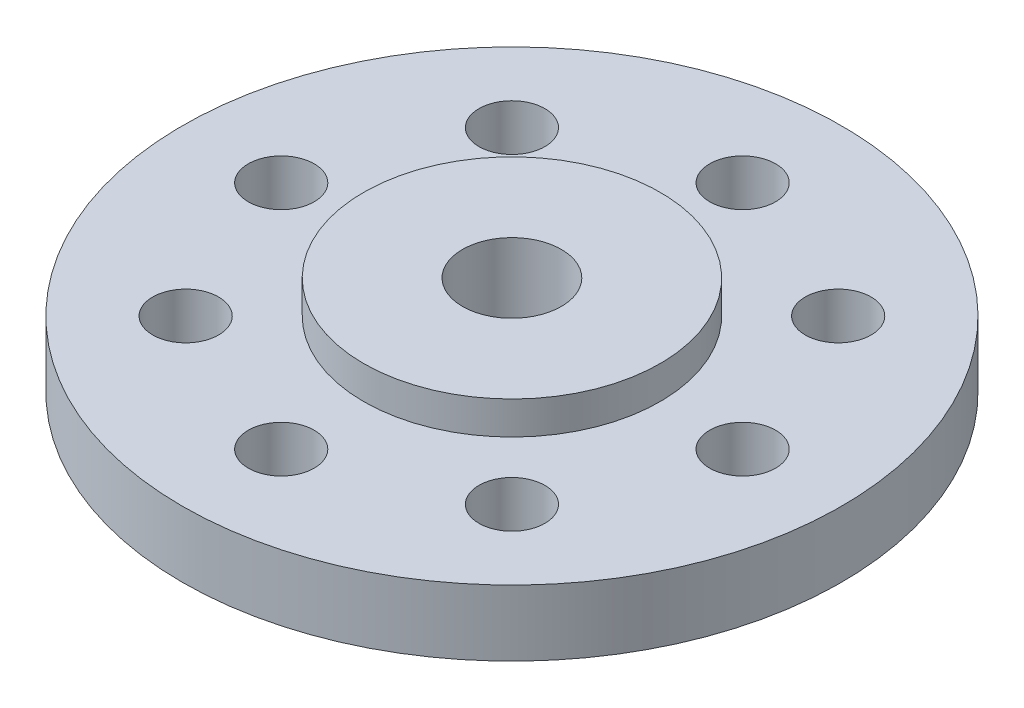
ISO-10303-21;
HEADER;
FILE_DESCRIPTION(('STEP AP214'),'2;1');
FILE_NAME('part.step','',(''),(''),'','','');
FILE_SCHEMA(('AUTOMOTIVE_DESIGN { 1 0 10303 214 1 1 1 1 }'));
ENDSEC;
DATA;
#1=APPLICATION_CONTEXT('core data for automotive mechanical design processes');
#2=APPLICATION_PROTOCOL_DEFINITION('international standard','automotive_design',2000,#1);
#3=PRODUCT_CONTEXT('',#1,'mechanical');
#4=PRODUCT('Part','Part','',(#3));
#5=PRODUCT_RELATED_PRODUCT_CATEGORY('part','',(#4));
#6=PRODUCT_DEFINITION_FORMATION('','',#4);
#7=PRODUCT_DEFINITION_CONTEXT('part definition',#1,'design');
#8=PRODUCT_DEFINITION('design','',#6,#7);
#9=PRODUCT_DEFINITION_SHAPE('','',#8);
#10=(LENGTH_UNIT() NAMED_UNIT(*) SI_UNIT(.MILLI.,.METRE.));
#11=(NAMED_UNIT(*) PLANE_ANGLE_UNIT() SI_UNIT($,.RADIAN.));
#12=(NAMED_UNIT(*) SI_UNIT($,.STERADIAN.) SOLID_ANGLE_UNIT());
#13=UNCERTAINTY_MEASURE_WITH_UNIT(LENGTH_MEASURE(1.E-05),#10,'distance_accuracy_value','');
#14=(GEOMETRIC_REPRESENTATION_CONTEXT(3) GLOBAL_UNCERTAINTY_ASSIGNED_CONTEXT((#13)) GLOBAL_UNIT_ASSIGNED_CONTEXT((#10,
#11,#12)) REPRESENTATION_CONTEXT('',''));
#15=CARTESIAN_POINT('',(0.,0.,0.));
#16=DIRECTION('',(0.,0.,1.));
#17=DIRECTION('',(1.,0.,0.));
#18=AXIS2_PLACEMENT_3D('',#15,#16,#17);
#19=CARTESIAN_POINT('',(0.,3.,0.));
#20=DIRECTION('',(0.,-1.,0.));
#21=DIRECTION('',(0.,0.,-1.));
#22=AXIS2_PLACEMENT_3D('',#19,#20,#21);
#23=CYLINDRICAL_SURFACE('',#22,10.);
#24=CARTESIAN_POINT('',(0.,3.,0.));
#25=DIRECTION('',(0.,1.,0.));
#26=DIRECTION('',(0.,0.,1.));
#27=AXIS2_PLACEMENT_3D('',#24,#25,#26);
#28=CIRCLE('',#27,10.);
#29=CARTESIAN_POINT('',(0.,3.,10.));
#30=VERTEX_POINT('',#29);
#31=EDGE_CURVE('E46',#30,#30,#28,.T.);
#32=ORIENTED_EDGE('',*,*,#31,.F.);
#33=EDGE_LOOP('',(#32));
#34=FACE_BOUND('',#33,.T.);
#35=CARTESIAN_POINT('',(0.,1.,0.));
#36=DIRECTION('',(0.,1.,0.));
#37=DIRECTION('',(0.,0.,1.));
#38=AXIS2_PLACEMENT_3D('',#35,#36,#37);
#39=CIRCLE('',#38,10.);
#40=CARTESIAN_POINT('',(0.,1.,10.));
#41=VERTEX_POINT('',#40);
#42=EDGE_CURVE('E51',#41,#41,#39,.T.);
#43=ORIENTED_EDGE('',*,*,#42,.T.);
#44=EDGE_LOOP('',(#43));
#45=FACE_BOUND('',#44,.T.);
#46=ADVANCED_FACE('F39',(#34,#45),#23,.T.);
#47=CARTESIAN_POINT('',(0.,3.,0.));
#48=DIRECTION('',(0.,1.,0.));
#49=DIRECTION('',(0.,0.,1.));
#50=AXIS2_PLACEMENT_3D('',#47,#48,#49);
#51=PLANE('',#50);
#52=CARTESIAN_POINT('',(-7.,3.,0.));
#53=DIRECTION('',(0.,1.,0.));
#54=DIRECTION('',(0.,0.,1.));
#55=AXIS2_PLACEMENT_3D('',#52,#53,#54);
#56=CIRCLE('',#55,1.);
#57=CARTESIAN_POINT('',(-7.,3.,1.));
#58=VERTEX_POINT('',#57);
#59=EDGE_CURVE('E96',#58,#58,#56,.F.);
#60=ORIENTED_EDGE('',*,*,#59,.T.);
#61=EDGE_LOOP('',(#60));
#62=FACE_BOUND('',#61,.T.);
#63=CARTESIAN_POINT('',(-4.94974746830583,3.,-4.94974746830584));
#64=DIRECTION('',(0.,1.,0.));
#65=DIRECTION('',(0.,0.,1.));
#66=AXIS2_PLACEMENT_3D('',#63,#64,#65);
#67=CIRCLE('',#66,1.);
#68=CARTESIAN_POINT('',(-4.94974746830583,3.,-3.94974746830584));
#69=VERTEX_POINT('',#68);
#70=EDGE_CURVE('E85',#69,#69,#67,.F.);
#71=ORIENTED_EDGE('',*,*,#70,.T.);
#72=EDGE_LOOP('',(#71));
#73=FACE_BOUND('',#72,.T.);
#74=CARTESIAN_POINT('',(0.,3.,-7.));
#75=DIRECTION('',(0.,1.,0.));
#76=DIRECTION('',(0.,0.,1.));
#77=AXIS2_PLACEMENT_3D('',#74,#75,#76);
#78=CIRCLE('',#77,1.);
#79=CARTESIAN_POINT('',(0.,3.,-6.));
#80=VERTEX_POINT('',#79);
#81=EDGE_CURVE('E82',#80,#80,#78,.F.);
#82=ORIENTED_EDGE('',*,*,#81,.T.);
#83=EDGE_LOOP('',(#82));
#84=FACE_BOUND('',#83,.T.);
#85=CARTESIAN_POINT('',(4.94974746830586,3.,-4.94974746830581));
#86=DIRECTION('',(0.,1.,0.));
#87=DIRECTION('',(0.,0.,1.));
#88=AXIS2_PLACEMENT_3D('',#85,#86,#87);
#89=CIRCLE('',#88,0.999999999999999);
#90=CARTESIAN_POINT('',(4.94974746830586,3.,-3.94974746830581));
#91=VERTEX_POINT('',#90);
#92=EDGE_CURVE('E79',#91,#91,#89,.F.);
#93=ORIENTED_EDGE('',*,*,#92,.T.);
#94=EDGE_LOOP('',(#93));
#95=FACE_BOUND('',#94,.T.);
#96=CARTESIAN_POINT('',(7.,3.,0.));
#97=DIRECTION('',(0.,1.,0.));
#98=DIRECTION('',(0.,0.,1.));
#99=AXIS2_PLACEMENT_3D('',#96,#97,#98);
#100=CIRCLE('',#99,0.999999999999999);
#101=CARTESIAN_POINT('',(7.,3.,1.00000000000005));
#102=VERTEX_POINT('',#101);
#103=EDGE_CURVE('E75',#102,#102,#100,.F.);
#104=ORIENTED_EDGE('',*,*,#103,.T.);
#105=EDGE_LOOP('',(#104));
#106=FACE_BOUND('',#105,.T.);
#107=CARTESIAN_POINT('',(4.94974746830579,3.,4.94974746830588));
#108=DIRECTION('',(0.,1.,0.));
#109=DIRECTION('',(0.,0.,1.));
#110=AXIS2_PLACEMENT_3D('',#107,#108,#109);
#111=CIRCLE('',#110,1.);
#112=CARTESIAN_POINT('',(4.94974746830579,3.,5.94974746830588));
#113=VERTEX_POINT('',#112);
#114=EDGE_CURVE('E71',#113,#113,#111,.F.);
#115=ORIENTED_EDGE('',*,*,#114,.T.);
#116=EDGE_LOOP('',(#115));
#117=FACE_BOUND('',#116,.T.);
#118=CARTESIAN_POINT('',(0.,3.,7.));
#119=DIRECTION('',(0.,1.,0.));
#120=DIRECTION('',(0.,0.,1.));
#121=AXIS2_PLACEMENT_3D('',#118,#119,#120);
#122=CIRCLE('',#121,1.);
#123=CARTESIAN_POINT('',(0.,3.,8.));
#124=VERTEX_POINT('',#123);
#125=EDGE_CURVE('E67',#124,#124,#122,.F.);
#126=ORIENTED_EDGE('',*,*,#125,.T.);
#127=EDGE_LOOP('',(#126));
#128=FACE_BOUND('',#127,.T.);
#129=CARTESIAN_POINT('',(-4.94974746830589,3.,4.94974746830577));
#130=DIRECTION('',(0.,1.,0.));
#131=DIRECTION('',(0.,0.,1.));
#132=AXIS2_PLACEMENT_3D('',#129,#130,#131);
#133=CIRCLE('',#132,1.);
#134=CARTESIAN_POINT('',(-4.94974746830589,3.,5.94974746830577));
#135=VERTEX_POINT('',#134);
#136=EDGE_CURVE('E62',#135,#135,#133,.F.);
#137=ORIENTED_EDGE('',*,*,#136,.T.);
#138=EDGE_LOOP('',(#137));
#139=FACE_BOUND('',#138,.T.);
#140=CARTESIAN_POINT('',(0.,3.,0.));
#141=DIRECTION('',(0.,1.,0.));
#142=DIRECTION('',(0.,0.,1.));
#143=AXIS2_PLACEMENT_3D('',#140,#141,#142);
#144=CIRCLE('',#143,4.5);
#145=CARTESIAN_POINT('',(0.,3.,4.5));
#146=VERTEX_POINT('',#145);
#147=EDGE_CURVE('E11',#146,#146,#144,.T.);
#148=ORIENTED_EDGE('',*,*,#147,.F.);
#149=EDGE_LOOP('',(#148));
#150=FACE_BOUND('',#149,.T.);
#151=ORIENTED_EDGE('',*,*,#31,.T.);
#152=EDGE_LOOP('',(#151));
#153=FACE_BOUND('',#152,.T.);
#154=ADVANCED_FACE('F110',(#62,#73,#84,#95,#106,#117,#128,#139,#150,#153),#51,.T.);
#155=CARTESIAN_POINT('',(0.,1.,0.));
#156=DIRECTION('',(0.,1.,0.));
#157=DIRECTION('',(0.,0.,1.));
#158=AXIS2_PLACEMENT_3D('',#155,#156,#157);
#159=PLANE('',#158);
#160=CARTESIAN_POINT('',(0.,1.,0.));
#161=DIRECTION('',(0.,1.,0.));
#162=DIRECTION('',(0.,0.,1.));
#163=AXIS2_PLACEMENT_3D('',#160,#161,#162);
#164=CIRCLE('',#163,1.5);
#165=CARTESIAN_POINT('',(0.,1.,1.5));
#166=VERTEX_POINT('',#165);
#167=EDGE_CURVE('E63',#166,#166,#164,.F.);
#168=ORIENTED_EDGE('',*,*,#167,.F.);
#169=EDGE_LOOP('',(#168));
#170=FACE_BOUND('',#169,.T.);
#171=CARTESIAN_POINT('',(-7.,1.,0.));
#172=DIRECTION('',(0.,1.,0.));
#173=DIRECTION('',(0.,0.,1.));
#174=AXIS2_PLACEMENT_3D('',#171,#172,#173);
#175=CIRCLE('',#174,1.);
#176=CARTESIAN_POINT('',(-7.,1.,1.));
#177=VERTEX_POINT('',#176);
#178=EDGE_CURVE('E42',#177,#177,#175,.F.);
#179=ORIENTED_EDGE('',*,*,#178,.F.);
#180=EDGE_LOOP('',(#179));
#181=FACE_BOUND('',#180,.T.);
#182=CARTESIAN_POINT('',(-4.94974746830583,1.,-4.94974746830584));
#183=DIRECTION('',(0.,1.,0.));
#184=DIRECTION('',(0.,0.,1.));
#185=AXIS2_PLACEMENT_3D('',#182,#183,#184);
#186=CIRCLE('',#185,1.);
#187=CARTESIAN_POINT('',(-4.94974746830583,1.,-3.94974746830584));
#188=VERTEX_POINT('',#187);
#189=EDGE_CURVE('E83',#188,#188,#186,.F.);
#190=ORIENTED_EDGE('',*,*,#189,.F.);
#191=EDGE_LOOP('',(#190));
#192=FACE_BOUND('',#191,.T.);
#193=CARTESIAN_POINT('',(0.,1.,-7.));
#194=DIRECTION('',(0.,1.,0.));
#195=DIRECTION('',(0.,0.,1.));
#196=AXIS2_PLACEMENT_3D('',#193,#194,#195);
#197=CIRCLE('',#196,1.);
#198=CARTESIAN_POINT('',(0.,1.,-6.));
#199=VERTEX_POINT('',#198);
#200=EDGE_CURVE('E80',#199,#199,#197,.F.);
#201=ORIENTED_EDGE('',*,*,#200,.F.);
#202=EDGE_LOOP('',(#201));
#203=FACE_BOUND('',#202,.T.);
#204=CARTESIAN_POINT('',(4.94974746830586,1.,-4.94974746830581));
#205=DIRECTION('',(0.,1.,0.));
#206=DIRECTION('',(0.,0.,1.));
#207=AXIS2_PLACEMENT_3D('',#204,#205,#206);
#208=CIRCLE('',#207,0.999999999999999);
#209=CARTESIAN_POINT('',(4.94974746830586,1.,-3.94974746830581));
#210=VERTEX_POINT('',#209);
#211=EDGE_CURVE('E76',#210,#210,#208,.F.);
#212=ORIENTED_EDGE('',*,*,#211,.F.);
#213=EDGE_LOOP('',(#212));
#214=FACE_BOUND('',#213,.T.);
#215=CARTESIAN_POINT('',(7.,1.,0.));
#216=DIRECTION('',(0.,1.,0.));
#217=DIRECTION('',(0.,0.,1.));
#218=AXIS2_PLACEMENT_3D('',#215,#216,#217);
#219=CIRCLE('',#218,0.999999999999999);
#220=CARTESIAN_POINT('',(7.,1.,1.00000000000005));
#221=VERTEX_POINT('',#220);
#222=EDGE_CURVE('E72',#221,#221,#219,.F.);
#223=ORIENTED_EDGE('',*,*,#222,.F.);
#224=EDGE_LOOP('',(#223));
#225=FACE_BOUND('',#224,.T.);
#226=CARTESIAN_POINT('',(4.94974746830579,1.,4.94974746830588));
#227=DIRECTION('',(0.,1.,0.));
#228=DIRECTION('',(0.,0.,1.));
#229=AXIS2_PLACEMENT_3D('',#226,#227,#228);
#230=CIRCLE('',#229,1.);
#231=CARTESIAN_POINT('',(4.94974746830579,1.,5.94974746830588));
#232=VERTEX_POINT('',#231);
#233=EDGE_CURVE('E68',#232,#232,#230,.F.);
#234=ORIENTED_EDGE('',*,*,#233,.F.);
#235=EDGE_LOOP('',(#234));
#236=FACE_BOUND('',#235,.T.);
#237=CARTESIAN_POINT('',(0.,1.,7.));
#238=DIRECTION('',(0.,1.,0.));
#239=DIRECTION('',(0.,0.,1.));
#240=AXIS2_PLACEMENT_3D('',#237,#238,#239);
#241=CIRCLE('',#240,1.);
#242=CARTESIAN_POINT('',(0.,1.,8.));
#243=VERTEX_POINT('',#242);
#244=EDGE_CURVE('E64',#243,#243,#241,.F.);
#245=ORIENTED_EDGE('',*,*,#244,.F.);
#246=EDGE_LOOP('',(#245));
#247=FACE_BOUND('',#246,.T.);
#248=CARTESIAN_POINT('',(-4.94974746830589,1.,4.94974746830577));
#249=DIRECTION('',(0.,1.,0.));
#250=DIRECTION('',(0.,0.,1.));
#251=AXIS2_PLACEMENT_3D('',#248,#249,#250);
#252=CIRCLE('',#251,1.);
#253=CARTESIAN_POINT('',(-4.94974746830589,1.,5.94974746830577));
#254=VERTEX_POINT('',#253);
#255=EDGE_CURVE('E59',#254,#254,#252,.F.);
#256=ORIENTED_EDGE('',*,*,#255,.F.);
#257=EDGE_LOOP('',(#256));
#258=FACE_BOUND('',#257,.T.);
#259=ORIENTED_EDGE('',*,*,#42,.F.);
#260=EDGE_LOOP('',(#259));
#261=FACE_BOUND('',#260,.T.);
#262=ADVANCED_FACE('F106',(#170,#181,#192,#203,#214,#225,#236,#247,#258,#261),#159,.F.);
#263=CARTESIAN_POINT('',(0.,4.,0.));
#264=DIRECTION('',(0.,-1.,0.));
#265=DIRECTION('',(0.,0.,-1.));
#266=AXIS2_PLACEMENT_3D('',#263,#264,#265);
#267=CYLINDRICAL_SURFACE('',#266,4.5);
#268=CARTESIAN_POINT('',(0.,4.,0.));
#269=DIRECTION('',(0.,1.,0.));
#270=DIRECTION('',(0.,0.,1.));
#271=AXIS2_PLACEMENT_3D('',#268,#269,#270);
#272=CIRCLE('',#271,4.5);
#273=CARTESIAN_POINT('',(0.,4.,4.5));
#274=VERTEX_POINT('',#273);
#275=EDGE_CURVE('E54',#274,#274,#272,.T.);
#276=ORIENTED_EDGE('',*,*,#275,.F.);
#277=EDGE_LOOP('',(#276));
#278=FACE_BOUND('',#277,.T.);
#279=ORIENTED_EDGE('',*,*,#147,.T.);
#280=EDGE_LOOP('',(#279));
#281=FACE_BOUND('',#280,.T.);
#282=ADVANCED_FACE('F109',(#278,#281),#267,.T.);
#283=CARTESIAN_POINT('',(0.,4.,0.));
#284=DIRECTION('',(0.,1.,0.));
#285=DIRECTION('',(0.,0.,1.));
#286=AXIS2_PLACEMENT_3D('',#283,#284,#285);
#287=PLANE('',#286);
#288=CARTESIAN_POINT('',(0.,4.,0.));
#289=DIRECTION('',(0.,1.,0.));
#290=DIRECTION('',(0.,0.,1.));
#291=AXIS2_PLACEMENT_3D('',#288,#289,#290);
#292=CIRCLE('',#291,1.5);
#293=CARTESIAN_POINT('',(0.,4.,1.5));
#294=VERTEX_POINT('',#293);
#295=EDGE_CURVE('E185',#294,#294,#292,.T.);
#296=ORIENTED_EDGE('',*,*,#295,.F.);
#297=EDGE_LOOP('',(#296));
#298=FACE_BOUND('',#297,.T.);
#299=ORIENTED_EDGE('',*,*,#275,.T.);
#300=EDGE_LOOP('',(#299));
#301=FACE_BOUND('',#300,.T.);
#302=ADVANCED_FACE('F141',(#298,#301),#287,.T.);
#303=CARTESIAN_POINT('',(0.,4.,0.));
#304=DIRECTION('',(0.,-1.,0.));
#305=DIRECTION('',(0.,0.,-1.));
#306=AXIS2_PLACEMENT_3D('',#303,#304,#305);
#307=CYLINDRICAL_SURFACE('',#306,1.5);
#308=ORIENTED_EDGE('',*,*,#295,.T.);
#309=EDGE_LOOP('',(#308));
#310=FACE_BOUND('',#309,.T.);
#311=ORIENTED_EDGE('',*,*,#167,.T.);
#312=EDGE_LOOP('',(#311));
#313=FACE_BOUND('',#312,.T.);
#314=ADVANCED_FACE('F145',(#310,#313),#307,.F.);
#315=CARTESIAN_POINT('',(-4.94974746830589,4.,4.94974746830577));
#316=DIRECTION('',(0.,-1.,0.));
#317=DIRECTION('',(0.,0.,-1.));
#318=AXIS2_PLACEMENT_3D('',#315,#316,#317);
#319=CYLINDRICAL_SURFACE('',#318,1.);
#320=ORIENTED_EDGE('',*,*,#136,.F.);
#321=EDGE_LOOP('',(#320));
#322=FACE_BOUND('',#321,.T.);
#323=ORIENTED_EDGE('',*,*,#255,.T.);
#324=EDGE_LOOP('',(#323));
#325=FACE_BOUND('',#324,.T.);
#326=ADVANCED_FACE('F147',(#322,#325),#319,.F.);
#327=CARTESIAN_POINT('',(0.,4.,7.));
#328=DIRECTION('',(0.,-1.,0.));
#329=DIRECTION('',(0.,0.,-1.));
#330=AXIS2_PLACEMENT_3D('',#327,#328,#329);
#331=CYLINDRICAL_SURFACE('',#330,1.);
#332=ORIENTED_EDGE('',*,*,#125,.F.);
#333=EDGE_LOOP('',(#332));
#334=FACE_BOUND('',#333,.T.);
#335=ORIENTED_EDGE('',*,*,#244,.T.);
#336=EDGE_LOOP('',(#335));
#337=FACE_BOUND('',#336,.T.);
#338=ADVANCED_FACE('F150',(#334,#337),#331,.F.);
#339=CARTESIAN_POINT('',(4.94974746830579,4.,4.94974746830588));
#340=DIRECTION('',(0.,-1.,0.));
#341=DIRECTION('',(0.,0.,-1.));
#342=AXIS2_PLACEMENT_3D('',#339,#340,#341);
#343=CYLINDRICAL_SURFACE('',#342,1.);
#344=ORIENTED_EDGE('',*,*,#114,.F.);
#345=EDGE_LOOP('',(#344));
#346=FACE_BOUND('',#345,.T.);
#347=ORIENTED_EDGE('',*,*,#233,.T.);
#348=EDGE_LOOP('',(#347));
#349=FACE_BOUND('',#348,.T.);
#350=ADVANCED_FACE('F154',(#346,#349),#343,.F.);
#351=CARTESIAN_POINT('',(7.,4.,0.));
#352=DIRECTION('',(0.,-1.,0.));
#353=DIRECTION('',(0.,0.,-1.));
#354=AXIS2_PLACEMENT_3D('',#351,#352,#353);
#355=CYLINDRICAL_SURFACE('',#354,0.999999999999999);
#356=ORIENTED_EDGE('',*,*,#103,.F.);
#357=EDGE_LOOP('',(#356));
#358=FACE_BOUND('',#357,.T.);
#359=ORIENTED_EDGE('',*,*,#222,.T.);
#360=EDGE_LOOP('',(#359));
#361=FACE_BOUND('',#360,.T.);
#362=ADVANCED_FACE('F158',(#358,#361),#355,.F.);
#363=CARTESIAN_POINT('',(4.94974746830586,4.,-4.94974746830581));
#364=DIRECTION('',(0.,-1.,0.));
#365=DIRECTION('',(0.,0.,-1.));
#366=AXIS2_PLACEMENT_3D('',#363,#364,#365);
#367=CYLINDRICAL_SURFACE('',#366,0.999999999999999);
#368=ORIENTED_EDGE('',*,*,#92,.F.);
#369=EDGE_LOOP('',(#368));
#370=FACE_BOUND('',#369,.T.);
#371=ORIENTED_EDGE('',*,*,#211,.T.);
#372=EDGE_LOOP('',(#371));
#373=FACE_BOUND('',#372,.T.);
#374=ADVANCED_FACE('F162',(#370,#373),#367,.F.);
#375=CARTESIAN_POINT('',(0.,4.,-7.));
#376=DIRECTION('',(0.,-1.,0.));
#377=DIRECTION('',(0.,0.,-1.));
#378=AXIS2_PLACEMENT_3D('',#375,#376,#377);
#379=CYLINDRICAL_SURFACE('',#378,1.);
#380=ORIENTED_EDGE('',*,*,#81,.F.);
#381=EDGE_LOOP('',(#380));
#382=FACE_BOUND('',#381,.T.);
#383=ORIENTED_EDGE('',*,*,#200,.T.);
#384=EDGE_LOOP('',(#383));
#385=FACE_BOUND('',#384,.T.);
#386=ADVANCED_FACE('F166',(#382,#385),#379,.F.);
#387=CARTESIAN_POINT('',(-4.94974746830583,4.,-4.94974746830584));
#388=DIRECTION('',(0.,-1.,0.));
#389=DIRECTION('',(0.,0.,-1.));
#390=AXIS2_PLACEMENT_3D('',#387,#388,#389);
#391=CYLINDRICAL_SURFACE('',#390,1.);
#392=ORIENTED_EDGE('',*,*,#70,.F.);
#393=EDGE_LOOP('',(#392));
#394=FACE_BOUND('',#393,.T.);
#395=ORIENTED_EDGE('',*,*,#189,.T.);
#396=EDGE_LOOP('',(#395));
#397=FACE_BOUND('',#396,.T.);
#398=ADVANCED_FACE('F170',(#394,#397),#391,.F.);
#399=CARTESIAN_POINT('',(-7.,4.,0.));
#400=DIRECTION('',(0.,-1.,0.));
#401=DIRECTION('',(0.,0.,-1.));
#402=AXIS2_PLACEMENT_3D('',#399,#400,#401);
#403=CYLINDRICAL_SURFACE('',#402,1.);
#404=ORIENTED_EDGE('',*,*,#59,.F.);
#405=EDGE_LOOP('',(#404));
#406=FACE_BOUND('',#405,.T.);
#407=ORIENTED_EDGE('',*,*,#178,.T.);
#408=EDGE_LOOP('',(#407));
#409=FACE_BOUND('',#408,.T.);
#410=ADVANCED_FACE('F104',(#406,#409),#403,.F.);
#411=CLOSED_SHELL('',(#46,#154,#262,#282,#302,#314,#326,#338,#350,#362,#374,#386,#398,#410));
#412=MANIFOLD_SOLID_BREP('B2',#411);
#413=CARTESIAN_POINT('',(0.,1.,0.));
#414=DIRECTION('',(0.,-1.,0.));
#415=DIRECTION('',(0.,0.,-1.));
#416=AXIS2_PLACEMENT_3D('',#413,#414,#415);
#417=CYLINDRICAL_SURFACE('',#416,4.5);
#418=CARTESIAN_POINT('',(0.,1.,0.));
#419=DIRECTION('',(0.,1.,0.));
#420=DIRECTION('',(0.,0.,1.));
#421=AXIS2_PLACEMENT_3D('',#418,#419,#420);
#422=CIRCLE('',#421,4.5);
#423=CARTESIAN_POINT('',(0.,1.,4.5));
#424=VERTEX_POINT('',#423);
#425=EDGE_CURVE('E38',#424,#424,#422,.T.);
#426=ORIENTED_EDGE('',*,*,#425,.F.);
#427=EDGE_LOOP('',(#426));
#428=FACE_BOUND('',#427,.T.);
#429=CARTESIAN_POINT('',(0.,0.,0.));
#430=DIRECTION('',(0.,1.,0.));
#431=DIRECTION('',(0.,0.,1.));
#432=AXIS2_PLACEMENT_3D('',#429,#430,#431);
#433=CIRCLE('',#432,4.5);
#434=CARTESIAN_POINT('',(0.,0.,4.5));
#435=VERTEX_POINT('',#434);
#436=EDGE_CURVE('E302',#435,#435,#433,.T.);
#437=ORIENTED_EDGE('',*,*,#436,.T.);
#438=EDGE_LOOP('',(#437));
#439=FACE_BOUND('',#438,.T.);
#440=ADVANCED_FACE('F299',(#428,#439),#417,.T.);
#441=CARTESIAN_POINT('',(0.,1.,0.));
#442=DIRECTION('',(0.,1.,0.));
#443=DIRECTION('',(0.,0.,1.));
#444=AXIS2_PLACEMENT_3D('',#441,#442,#443);
#445=PLANE('',#444);
#446=CARTESIAN_POINT('',(0.,1.,0.));
#447=DIRECTION('',(0.,1.,0.));
#448=DIRECTION('',(0.,0.,1.));
#449=AXIS2_PLACEMENT_3D('',#446,#447,#448);
#450=CIRCLE('',#449,1.5);
#451=CARTESIAN_POINT('',(0.,1.,1.5));
#452=VERTEX_POINT('',#451);
#453=EDGE_CURVE('E309',#452,#452,#450,.F.);
#454=ORIENTED_EDGE('',*,*,#453,.T.);
#455=EDGE_LOOP('',(#454));
#456=FACE_BOUND('',#455,.T.);
#457=ORIENTED_EDGE('',*,*,#425,.T.);
#458=EDGE_LOOP('',(#457));
#459=FACE_BOUND('',#458,.T.);
#460=ADVANCED_FACE('F327',(#456,#459),#445,.T.);
#461=CARTESIAN_POINT('',(0.,0.,0.));
#462=DIRECTION('',(0.,1.,0.));
#463=DIRECTION('',(0.,0.,1.));
#464=AXIS2_PLACEMENT_3D('',#461,#462,#463);
#465=PLANE('',#464);
#466=CARTESIAN_POINT('',(0.,0.,0.));
#467=DIRECTION('',(0.,1.,0.));
#468=DIRECTION('',(0.,0.,1.));
#469=AXIS2_PLACEMENT_3D('',#466,#467,#468);
#470=CIRCLE('',#469,1.5);
#471=CARTESIAN_POINT('',(0.,0.,1.5));
#472=VERTEX_POINT('',#471);
#473=EDGE_CURVE('E313',#472,#472,#470,.T.);
#474=ORIENTED_EDGE('',*,*,#473,.T.);
#475=EDGE_LOOP('',(#474));
#476=FACE_BOUND('',#475,.T.);
#477=ORIENTED_EDGE('',*,*,#436,.F.);
#478=EDGE_LOOP('',(#477));
#479=FACE_BOUND('',#478,.T.);
#480=ADVANCED_FACE('F317',(#476,#479),#465,.F.);
#481=CARTESIAN_POINT('',(0.,4.,0.));
#482=DIRECTION('',(0.,-1.,0.));
#483=DIRECTION('',(0.,0.,-1.));
#484=AXIS2_PLACEMENT_3D('',#481,#482,#483);
#485=CYLINDRICAL_SURFACE('',#484,1.5);
#486=ORIENTED_EDGE('',*,*,#453,.F.);
#487=EDGE_LOOP('',(#486));
#488=FACE_BOUND('',#487,.T.);
#489=ORIENTED_EDGE('',*,*,#473,.F.);
#490=EDGE_LOOP('',(#489));
#491=FACE_BOUND('',#490,.T.);
#492=ADVANCED_FACE('F320',(#488,#491),#485,.F.);
#493=CLOSED_SHELL('',(#440,#460,#480,#492));
#494=MANIFOLD_SOLID_BREP('B6',#493);
#495=ADVANCED_BREP_SHAPE_REPRESENTATION('',(#18,#412,#494),#14);
#496=SHAPE_DEFINITION_REPRESENTATION(#9,#495);
ENDSEC;
END-ISO-10303-21;
